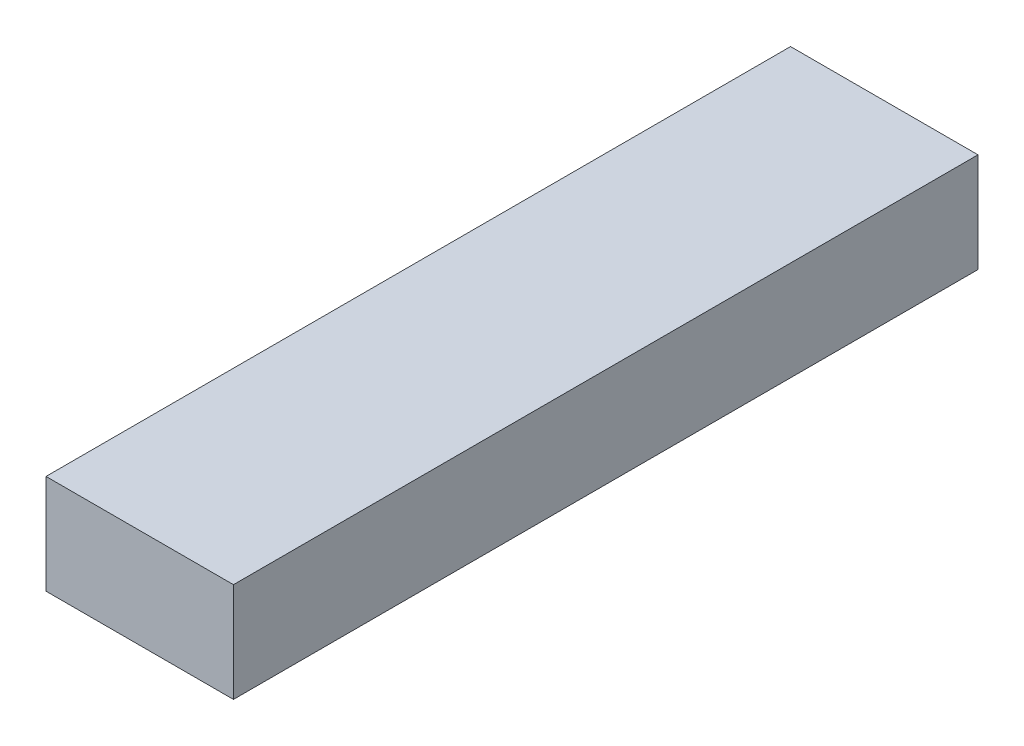
ISO-10303-21;
HEADER;
FILE_DESCRIPTION(('STEP AP214'),'2;1');
FILE_NAME('part.step','',(''),(''),'','','');
FILE_SCHEMA(('AUTOMOTIVE_DESIGN { 1 0 10303 214 1 1 1 1 }'));
ENDSEC;
DATA;
#1=APPLICATION_CONTEXT('core data for automotive mechanical design processes');
#2=APPLICATION_PROTOCOL_DEFINITION('international standard','automotive_design',2000,#1);
#3=PRODUCT_CONTEXT('',#1,'mechanical');
#4=PRODUCT('Part','Part','',(#3));
#5=PRODUCT_RELATED_PRODUCT_CATEGORY('part','',(#4));
#6=PRODUCT_DEFINITION_FORMATION('','',#4);
#7=PRODUCT_DEFINITION_CONTEXT('part definition',#1,'design');
#8=PRODUCT_DEFINITION('design','',#6,#7);
#9=PRODUCT_DEFINITION_SHAPE('','',#8);
#10=(LENGTH_UNIT() NAMED_UNIT(*) SI_UNIT(.MILLI.,.METRE.));
#11=(NAMED_UNIT(*) PLANE_ANGLE_UNIT() SI_UNIT($,.RADIAN.));
#12=(NAMED_UNIT(*) SI_UNIT($,.STERADIAN.) SOLID_ANGLE_UNIT());
#13=UNCERTAINTY_MEASURE_WITH_UNIT(LENGTH_MEASURE(1.E-05),#10,'distance_accuracy_value','');
#14=(GEOMETRIC_REPRESENTATION_CONTEXT(3) GLOBAL_UNCERTAINTY_ASSIGNED_CONTEXT((#13)) GLOBAL_UNIT_ASSIGNED_CONTEXT((#10,
#11,#12)) REPRESENTATION_CONTEXT('',''));
#15=CARTESIAN_POINT('',(0.,0.,0.));
#16=DIRECTION('',(0.,0.,1.));
#17=DIRECTION('',(1.,0.,0.));
#18=AXIS2_PLACEMENT_3D('',#15,#16,#17);
#19=CARTESIAN_POINT('',(0.,0.,350.));
#20=DIRECTION('',(1.,0.,0.));
#21=DIRECTION('',(0.,0.,-1.));
#22=AXIS2_PLACEMENT_3D('',#19,#20,#21);
#23=PLANE('',#22);
#24=DIRECTION('',(0.,-1.,0.));
#25=VECTOR('',#24,1.);
#26=CARTESIAN_POINT('',(0.,0.,0.));
#27=LINE('',#26,#25);
#28=CARTESIAN_POINT('',(0.,46.7296752600793,0.));
#29=VERTEX_POINT('',#28);
#30=CARTESIAN_POINT('',(0.,0.,0.));
#31=VERTEX_POINT('',#30);
#32=EDGE_CURVE('E107',#29,#31,#27,.T.);
#33=ORIENTED_EDGE('',*,*,#32,.T.);
#34=DIRECTION('',(0.,0.,-1.));
#35=VECTOR('',#34,1.);
#36=CARTESIAN_POINT('',(0.,0.,350.));
#37=LINE('',#36,#35);
#38=CARTESIAN_POINT('',(0.,0.,350.));
#39=VERTEX_POINT('',#38);
#40=EDGE_CURVE('E11',#39,#31,#37,.T.);
#41=ORIENTED_EDGE('',*,*,#40,.F.);
#42=DIRECTION('',(0.,-1.,0.));
#43=VECTOR('',#42,1.);
#44=CARTESIAN_POINT('',(0.,0.,350.));
#45=LINE('',#44,#43);
#46=CARTESIAN_POINT('',(0.,46.7296752600793,350.));
#47=VERTEX_POINT('',#46);
#48=EDGE_CURVE('E91',#47,#39,#45,.T.);
#49=ORIENTED_EDGE('',*,*,#48,.F.);
#50=DIRECTION('',(0.,0.,-1.));
#51=VECTOR('',#50,1.);
#52=CARTESIAN_POINT('',(0.,46.7296752600793,350.));
#53=LINE('',#52,#51);
#54=EDGE_CURVE('E103',#47,#29,#53,.T.);
#55=ORIENTED_EDGE('',*,*,#54,.T.);
#56=EDGE_LOOP('',(#33,#41,#49,#55));
#57=FACE_BOUND('',#56,.T.);
#58=ADVANCED_FACE('F39',(#57),#23,.F.);
#59=CARTESIAN_POINT('',(0.,0.,350.));
#60=DIRECTION('',(0.,1.,0.));
#61=DIRECTION('',(0.,0.,1.));
#62=AXIS2_PLACEMENT_3D('',#59,#60,#61);
#63=PLANE('',#62);
#64=DIRECTION('',(1.,0.,0.));
#65=VECTOR('',#64,1.);
#66=CARTESIAN_POINT('',(0.,0.,0.));
#67=LINE('',#66,#65);
#68=CARTESIAN_POINT('',(88.1254421778171,0.,0.));
#69=VERTEX_POINT('',#68);
#70=EDGE_CURVE('E96',#31,#69,#67,.T.);
#71=ORIENTED_EDGE('',*,*,#70,.T.);
#72=DIRECTION('',(0.,0.,-1.));
#73=VECTOR('',#72,1.);
#74=CARTESIAN_POINT('',(88.1254421778171,0.,350.));
#75=LINE('',#74,#73);
#76=CARTESIAN_POINT('',(88.1254421778171,0.,350.));
#77=VERTEX_POINT('',#76);
#78=EDGE_CURVE('E48',#77,#69,#75,.T.);
#79=ORIENTED_EDGE('',*,*,#78,.F.);
#80=DIRECTION('',(1.,0.,0.));
#81=VECTOR('',#80,1.);
#82=CARTESIAN_POINT('',(0.,0.,350.));
#83=LINE('',#82,#81);
#84=EDGE_CURVE('E86',#39,#77,#83,.T.);
#85=ORIENTED_EDGE('',*,*,#84,.F.);
#86=ORIENTED_EDGE('',*,*,#40,.T.);
#87=EDGE_LOOP('',(#71,#79,#85,#86));
#88=FACE_BOUND('',#87,.T.);
#89=ADVANCED_FACE('F95',(#88),#63,.F.);
#90=CARTESIAN_POINT('',(88.1254421778171,0.,350.));
#91=DIRECTION('',(-1.,0.,0.));
#92=DIRECTION('',(0.,0.,1.));
#93=AXIS2_PLACEMENT_3D('',#90,#91,#92);
#94=PLANE('',#93);
#95=DIRECTION('',(0.,1.,0.));
#96=VECTOR('',#95,1.);
#97=CARTESIAN_POINT('',(88.1254421778171,0.,0.));
#98=LINE('',#97,#96);
#99=CARTESIAN_POINT('',(88.1254421778171,46.7296752600793,0.));
#100=VERTEX_POINT('',#99);
#101=EDGE_CURVE('E73',#69,#100,#98,.T.);
#102=ORIENTED_EDGE('',*,*,#101,.T.);
#103=DIRECTION('',(0.,0.,-1.));
#104=VECTOR('',#103,1.);
#105=CARTESIAN_POINT('',(88.1254421778171,46.7296752600793,350.));
#106=LINE('',#105,#104);
#107=CARTESIAN_POINT('',(88.1254421778171,46.7296752600793,350.));
#108=VERTEX_POINT('',#107);
#109=EDGE_CURVE('E98',#108,#100,#106,.T.);
#110=ORIENTED_EDGE('',*,*,#109,.F.);
#111=DIRECTION('',(0.,1.,0.));
#112=VECTOR('',#111,1.);
#113=CARTESIAN_POINT('',(88.1254421778171,0.,350.));
#114=LINE('',#113,#112);
#115=EDGE_CURVE('E89',#77,#108,#114,.T.);
#116=ORIENTED_EDGE('',*,*,#115,.F.);
#117=ORIENTED_EDGE('',*,*,#78,.T.);
#118=EDGE_LOOP('',(#102,#110,#116,#117));
#119=FACE_BOUND('',#118,.T.);
#120=ADVANCED_FACE('F99',(#119),#94,.F.);
#121=CARTESIAN_POINT('',(0.,46.7296752600793,350.));
#122=DIRECTION('',(0.,-1.,0.));
#123=DIRECTION('',(0.,0.,-1.));
#124=AXIS2_PLACEMENT_3D('',#121,#122,#123);
#125=PLANE('',#124);
#126=DIRECTION('',(-1.,0.,0.));
#127=VECTOR('',#126,1.);
#128=CARTESIAN_POINT('',(0.,46.7296752600793,0.));
#129=LINE('',#128,#127);
#130=EDGE_CURVE('E79',#100,#29,#129,.T.);
#131=ORIENTED_EDGE('',*,*,#130,.T.);
#132=ORIENTED_EDGE('',*,*,#54,.F.);
#133=DIRECTION('',(-1.,0.,0.));
#134=VECTOR('',#133,1.);
#135=CARTESIAN_POINT('',(0.,46.7296752600793,350.));
#136=LINE('',#135,#134);
#137=EDGE_CURVE('E56',#108,#47,#136,.T.);
#138=ORIENTED_EDGE('',*,*,#137,.F.);
#139=ORIENTED_EDGE('',*,*,#109,.T.);
#140=EDGE_LOOP('',(#131,#132,#138,#139));
#141=FACE_BOUND('',#140,.T.);
#142=ADVANCED_FACE('F120',(#141),#125,.F.);
#143=CARTESIAN_POINT('',(0.,0.,350.));
#144=DIRECTION('',(0.,0.,-1.));
#145=DIRECTION('',(-1.,0.,0.));
#146=AXIS2_PLACEMENT_3D('',#143,#144,#145);
#147=PLANE('',#146);
#148=ORIENTED_EDGE('',*,*,#48,.T.);
#149=ORIENTED_EDGE('',*,*,#84,.T.);
#150=ORIENTED_EDGE('',*,*,#115,.T.);
#151=ORIENTED_EDGE('',*,*,#137,.T.);
#152=EDGE_LOOP('',(#148,#149,#150,#151));
#153=FACE_BOUND('',#152,.T.);
#154=ADVANCED_FACE('F87',(#153),#147,.F.);
#155=CARTESIAN_POINT('',(0.,0.,0.));
#156=DIRECTION('',(0.,0.,-1.));
#157=DIRECTION('',(-1.,0.,0.));
#158=AXIS2_PLACEMENT_3D('',#155,#156,#157);
#159=PLANE('',#158);
#160=ORIENTED_EDGE('',*,*,#32,.F.);
#161=ORIENTED_EDGE('',*,*,#130,.F.);
#162=ORIENTED_EDGE('',*,*,#101,.F.);
#163=ORIENTED_EDGE('',*,*,#70,.F.);
#164=EDGE_LOOP('',(#160,#161,#162,#163));
#165=FACE_BOUND('',#164,.T.);
#166=ADVANCED_FACE('F123',(#165),#159,.T.);
#167=CLOSED_SHELL('',(#58,#89,#120,#142,#154,#166));
#168=MANIFOLD_SOLID_BREP('B2',#167);
#169=ADVANCED_BREP_SHAPE_REPRESENTATION('',(#18,#168),#14);
#170=SHAPE_DEFINITION_REPRESENTATION(#9,#169);
ENDSEC;
END-ISO-10303-21;
